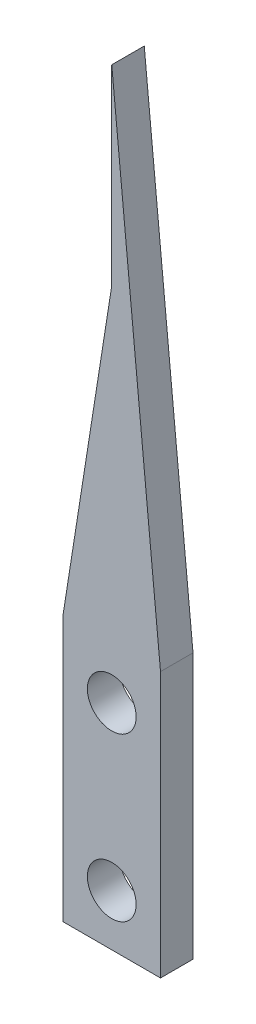
ISO-10303-21;
HEADER;
FILE_DESCRIPTION(('STEP AP214'),'2;1');
FILE_NAME('part.step','',(''),(''),'','','');
FILE_SCHEMA(('AUTOMOTIVE_DESIGN { 1 0 10303 214 1 1 1 1 }'));
ENDSEC;
DATA;
#1=APPLICATION_CONTEXT('core data for automotive mechanical design processes');
#2=APPLICATION_PROTOCOL_DEFINITION('international standard','automotive_design',2000,#1);
#3=PRODUCT_CONTEXT('',#1,'mechanical');
#4=PRODUCT('Part','Part','',(#3));
#5=PRODUCT_RELATED_PRODUCT_CATEGORY('part','',(#4));
#6=PRODUCT_DEFINITION_FORMATION('','',#4);
#7=PRODUCT_DEFINITION_CONTEXT('part definition',#1,'design');
#8=PRODUCT_DEFINITION('design','',#6,#7);
#9=PRODUCT_DEFINITION_SHAPE('','',#8);
#10=(LENGTH_UNIT() NAMED_UNIT(*) SI_UNIT(.MILLI.,.METRE.));
#11=(NAMED_UNIT(*) PLANE_ANGLE_UNIT() SI_UNIT($,.RADIAN.));
#12=(NAMED_UNIT(*) SI_UNIT($,.STERADIAN.) SOLID_ANGLE_UNIT());
#13=UNCERTAINTY_MEASURE_WITH_UNIT(LENGTH_MEASURE(1.E-05),#10,'distance_accuracy_value','');
#14=(GEOMETRIC_REPRESENTATION_CONTEXT(3) GLOBAL_UNCERTAINTY_ASSIGNED_CONTEXT((#13)) GLOBAL_UNIT_ASSIGNED_CONTEXT((#10,
#11,#12)) REPRESENTATION_CONTEXT('',''));
#15=CARTESIAN_POINT('',(0.,0.,0.));
#16=DIRECTION('',(0.,0.,1.));
#17=DIRECTION('',(1.,0.,0.));
#18=AXIS2_PLACEMENT_3D('',#15,#16,#17);
#19=CARTESIAN_POINT('',(0.,0.,2.));
#20=DIRECTION('',(0.,0.,1.));
#21=DIRECTION('',(1.,0.,0.));
#22=AXIS2_PLACEMENT_3D('',#19,#20,#21);
#23=PLANE('',#22);
#24=CARTESIAN_POINT('',(0.,0.,2.));
#25=DIRECTION('',(0.,0.,1.));
#26=DIRECTION('',(1.,0.,0.));
#27=AXIS2_PLACEMENT_3D('',#24,#25,#26);
#28=CIRCLE('',#27,1.5);
#29=CARTESIAN_POINT('',(1.5,0.,2.));
#30=VERTEX_POINT('',#29);
#31=EDGE_CURVE('E122',#30,#30,#28,.T.);
#32=ORIENTED_EDGE('',*,*,#31,.F.);
#33=EDGE_LOOP('',(#32));
#34=FACE_BOUND('',#33,.T.);
#35=DIRECTION('',(0.,-1.,0.));
#36=VECTOR('',#35,1.);
#37=CARTESIAN_POINT('',(0.,22.2285133566871,2.));
#38=LINE('',#37,#36);
#39=CARTESIAN_POINT('',(0.,34.,2.));
#40=VERTEX_POINT('',#39);
#41=CARTESIAN_POINT('',(0.,22.2285133566871,2.));
#42=VERTEX_POINT('',#41);
#43=EDGE_CURVE('E129',#40,#42,#38,.T.);
#44=ORIENTED_EDGE('',*,*,#43,.T.);
#45=DIRECTION('',(-0.15544898073964,-0.987843922078284,0.));
#46=VECTOR('',#45,1.);
#47=CARTESIAN_POINT('',(-3.,3.1641762852305,2.));
#48=LINE('',#47,#46);
#49=CARTESIAN_POINT('',(-3.,3.1641762852305,2.));
#50=VERTEX_POINT('',#49);
#51=EDGE_CURVE('E87',#42,#50,#48,.T.);
#52=ORIENTED_EDGE('',*,*,#51,.T.);
#53=DIRECTION('',(0.,-1.,0.));
#54=VECTOR('',#53,1.);
#55=CARTESIAN_POINT('',(-3.,3.1641762852305,2.));
#56=LINE('',#55,#54);
#57=CARTESIAN_POINT('',(-3.,-13.1641762852305,2.));
#58=VERTEX_POINT('',#57);
#59=EDGE_CURVE('E100',#50,#58,#56,.T.);
#60=ORIENTED_EDGE('',*,*,#59,.T.);
#61=DIRECTION('',(1.,0.,0.));
#62=VECTOR('',#61,1.);
#63=CARTESIAN_POINT('',(3.,-13.1641762852305,2.));
#64=LINE('',#63,#62);
#65=CARTESIAN_POINT('',(3.,-13.1641762852305,2.));
#66=VERTEX_POINT('',#65);
#67=EDGE_CURVE('E94',#58,#66,#64,.T.);
#68=ORIENTED_EDGE('',*,*,#67,.T.);
#69=DIRECTION('',(0.,1.,0.));
#70=VECTOR('',#69,1.);
#71=CARTESIAN_POINT('',(3.,3.16417628523051,2.));
#72=LINE('',#71,#70);
#73=CARTESIAN_POINT('',(3.,3.16417628523051,2.));
#74=VERTEX_POINT('',#73);
#75=EDGE_CURVE('E98',#66,#74,#72,.T.);
#76=ORIENTED_EDGE('',*,*,#75,.T.);
#77=DIRECTION('',(-0.0968322486260107,0.995300716178799,0.));
#78=VECTOR('',#77,1.);
#79=CARTESIAN_POINT('',(3.,3.16417628523051,2.));
#80=LINE('',#79,#78);
#81=EDGE_CURVE('E50',#74,#40,#80,.T.);
#82=ORIENTED_EDGE('',*,*,#81,.T.);
#83=EDGE_LOOP('',(#44,#52,#60,#68,#76,#82));
#84=FACE_BOUND('',#83,.T.);
#85=CARTESIAN_POINT('',(0.,-10.,2.));
#86=DIRECTION('',(0.,0.,1.));
#87=DIRECTION('',(1.,0.,0.));
#88=AXIS2_PLACEMENT_3D('',#85,#86,#87);
#89=CIRCLE('',#88,1.5);
#90=CARTESIAN_POINT('',(1.5,-10.,2.));
#91=VERTEX_POINT('',#90);
#92=EDGE_CURVE('E171',#91,#91,#89,.T.);
#93=ORIENTED_EDGE('',*,*,#92,.F.);
#94=EDGE_LOOP('',(#93));
#95=FACE_BOUND('',#94,.T.);
#96=ADVANCED_FACE('F33',(#34,#84,#95),#23,.T.);
#97=CARTESIAN_POINT('',(0.,0.,0.));
#98=DIRECTION('',(0.,0.,1.));
#99=DIRECTION('',(1.,0.,0.));
#100=AXIS2_PLACEMENT_3D('',#97,#98,#99);
#101=PLANE('',#100);
#102=DIRECTION('',(0.,-1.,0.));
#103=VECTOR('',#102,1.);
#104=CARTESIAN_POINT('',(0.,22.2285133566871,0.));
#105=LINE('',#104,#103);
#106=CARTESIAN_POINT('',(0.,34.,0.));
#107=VERTEX_POINT('',#106);
#108=CARTESIAN_POINT('',(0.,22.2285133566871,0.));
#109=VERTEX_POINT('',#108);
#110=EDGE_CURVE('E118',#107,#109,#105,.T.);
#111=ORIENTED_EDGE('',*,*,#110,.F.);
#112=DIRECTION('',(-0.0968322486260107,0.995300716178799,0.));
#113=VECTOR('',#112,1.);
#114=CARTESIAN_POINT('',(3.,3.16417628523051,0.));
#115=LINE('',#114,#113);
#116=CARTESIAN_POINT('',(3.,3.16417628523051,0.));
#117=VERTEX_POINT('',#116);
#118=EDGE_CURVE('E79',#117,#107,#115,.T.);
#119=ORIENTED_EDGE('',*,*,#118,.F.);
#120=DIRECTION('',(0.,1.,0.));
#121=VECTOR('',#120,1.);
#122=CARTESIAN_POINT('',(3.,3.16417628523051,0.));
#123=LINE('',#122,#121);
#124=CARTESIAN_POINT('',(3.,-13.1641762852305,0.));
#125=VERTEX_POINT('',#124);
#126=EDGE_CURVE('E73',#125,#117,#123,.T.);
#127=ORIENTED_EDGE('',*,*,#126,.F.);
#128=DIRECTION('',(1.,0.,0.));
#129=VECTOR('',#128,1.);
#130=CARTESIAN_POINT('',(3.,-13.1641762852305,0.));
#131=LINE('',#130,#129);
#132=CARTESIAN_POINT('',(-3.,-13.1641762852305,0.));
#133=VERTEX_POINT('',#132);
#134=EDGE_CURVE('E108',#133,#125,#131,.T.);
#135=ORIENTED_EDGE('',*,*,#134,.F.);
#136=DIRECTION('',(0.,-1.,0.));
#137=VECTOR('',#136,1.);
#138=CARTESIAN_POINT('',(-3.,3.1641762852305,0.));
#139=LINE('',#138,#137);
#140=CARTESIAN_POINT('',(-3.,3.1641762852305,0.));
#141=VERTEX_POINT('',#140);
#142=EDGE_CURVE('E124',#141,#133,#139,.T.);
#143=ORIENTED_EDGE('',*,*,#142,.F.);
#144=DIRECTION('',(-0.15544898073964,-0.987843922078284,0.));
#145=VECTOR('',#144,1.);
#146=CARTESIAN_POINT('',(-3.,3.1641762852305,0.));
#147=LINE('',#146,#145);
#148=EDGE_CURVE('E121',#109,#141,#147,.T.);
#149=ORIENTED_EDGE('',*,*,#148,.F.);
#150=EDGE_LOOP('',(#111,#119,#127,#135,#143,#149));
#151=FACE_BOUND('',#150,.T.);
#152=CARTESIAN_POINT('',(0.,0.,0.));
#153=DIRECTION('',(0.,0.,1.));
#154=DIRECTION('',(1.,0.,0.));
#155=AXIS2_PLACEMENT_3D('',#152,#153,#154);
#156=CIRCLE('',#155,1.5);
#157=CARTESIAN_POINT('',(1.5,0.,0.));
#158=VERTEX_POINT('',#157);
#159=EDGE_CURVE('E177',#158,#158,#156,.T.);
#160=ORIENTED_EDGE('',*,*,#159,.T.);
#161=EDGE_LOOP('',(#160));
#162=FACE_BOUND('',#161,.T.);
#163=CARTESIAN_POINT('',(0.,-10.,0.));
#164=DIRECTION('',(0.,0.,1.));
#165=DIRECTION('',(1.,0.,0.));
#166=AXIS2_PLACEMENT_3D('',#163,#164,#165);
#167=CIRCLE('',#166,1.5);
#168=CARTESIAN_POINT('',(1.5,-10.,0.));
#169=VERTEX_POINT('',#168);
#170=EDGE_CURVE('E174',#169,#169,#167,.T.);
#171=ORIENTED_EDGE('',*,*,#170,.T.);
#172=EDGE_LOOP('',(#171));
#173=FACE_BOUND('',#172,.T.);
#174=ADVANCED_FACE('F138',(#151,#162,#173),#101,.F.);
#175=CARTESIAN_POINT('',(0.,22.2285133566871,2.));
#176=DIRECTION('',(1.,0.,0.));
#177=DIRECTION('',(0.,1.,0.));
#178=AXIS2_PLACEMENT_3D('',#175,#176,#177);
#179=PLANE('',#178);
#180=ORIENTED_EDGE('',*,*,#110,.T.);
#181=DIRECTION('',(0.,0.,-1.));
#182=VECTOR('',#181,1.);
#183=CARTESIAN_POINT('',(0.,22.2285133566871,2.));
#184=LINE('',#183,#182);
#185=EDGE_CURVE('E11',#42,#109,#184,.T.);
#186=ORIENTED_EDGE('',*,*,#185,.F.);
#187=ORIENTED_EDGE('',*,*,#43,.F.);
#188=DIRECTION('',(0.,0.,-1.));
#189=VECTOR('',#188,1.);
#190=CARTESIAN_POINT('',(0.,34.,2.));
#191=LINE('',#190,#189);
#192=EDGE_CURVE('E114',#40,#107,#191,.T.);
#193=ORIENTED_EDGE('',*,*,#192,.T.);
#194=EDGE_LOOP('',(#180,#186,#187,#193));
#195=FACE_BOUND('',#194,.T.);
#196=ADVANCED_FACE('F35',(#195),#179,.F.);
#197=CARTESIAN_POINT('',(-3.,3.1641762852305,2.));
#198=DIRECTION('',(0.987843922078284,-0.15544898073964,0.));
#199=DIRECTION('',(0.15544898073964,0.987843922078284,0.));
#200=AXIS2_PLACEMENT_3D('',#197,#198,#199);
#201=PLANE('',#200);
#202=ORIENTED_EDGE('',*,*,#148,.T.);
#203=DIRECTION('',(0.,0.,-1.));
#204=VECTOR('',#203,1.);
#205=CARTESIAN_POINT('',(-3.,3.1641762852305,2.));
#206=LINE('',#205,#204);
#207=EDGE_CURVE('E42',#50,#141,#206,.T.);
#208=ORIENTED_EDGE('',*,*,#207,.F.);
#209=ORIENTED_EDGE('',*,*,#51,.F.);
#210=ORIENTED_EDGE('',*,*,#185,.T.);
#211=EDGE_LOOP('',(#202,#208,#209,#210));
#212=FACE_BOUND('',#211,.T.);
#213=ADVANCED_FACE('F218',(#212),#201,.F.);
#214=CARTESIAN_POINT('',(-3.,3.1641762852305,2.));
#215=DIRECTION('',(1.,0.,0.));
#216=DIRECTION('',(0.,1.,0.));
#217=AXIS2_PLACEMENT_3D('',#214,#215,#216);
#218=PLANE('',#217);
#219=ORIENTED_EDGE('',*,*,#142,.T.);
#220=DIRECTION('',(0.,0.,-1.));
#221=VECTOR('',#220,1.);
#222=CARTESIAN_POINT('',(-3.,-13.1641762852305,2.));
#223=LINE('',#222,#221);
#224=EDGE_CURVE('E109',#58,#133,#223,.T.);
#225=ORIENTED_EDGE('',*,*,#224,.F.);
#226=ORIENTED_EDGE('',*,*,#59,.F.);
#227=ORIENTED_EDGE('',*,*,#207,.T.);
#228=EDGE_LOOP('',(#219,#225,#226,#227));
#229=FACE_BOUND('',#228,.T.);
#230=ADVANCED_FACE('F135',(#229),#218,.F.);
#231=CARTESIAN_POINT('',(3.,-13.1641762852305,2.));
#232=DIRECTION('',(0.,1.,0.));
#233=DIRECTION('',(-1.,0.,0.));
#234=AXIS2_PLACEMENT_3D('',#231,#232,#233);
#235=PLANE('',#234);
#236=ORIENTED_EDGE('',*,*,#134,.T.);
#237=DIRECTION('',(0.,0.,-1.));
#238=VECTOR('',#237,1.);
#239=CARTESIAN_POINT('',(3.,-13.1641762852305,2.));
#240=LINE('',#239,#238);
#241=EDGE_CURVE('E105',#66,#125,#240,.T.);
#242=ORIENTED_EDGE('',*,*,#241,.F.);
#243=ORIENTED_EDGE('',*,*,#67,.F.);
#244=ORIENTED_EDGE('',*,*,#224,.T.);
#245=EDGE_LOOP('',(#236,#242,#243,#244));
#246=FACE_BOUND('',#245,.T.);
#247=ADVANCED_FACE('F106',(#246),#235,.F.);
#248=CARTESIAN_POINT('',(3.,3.16417628523051,2.));
#249=DIRECTION('',(-1.,0.,0.));
#250=DIRECTION('',(0.,-1.,0.));
#251=AXIS2_PLACEMENT_3D('',#248,#249,#250);
#252=PLANE('',#251);
#253=ORIENTED_EDGE('',*,*,#126,.T.);
#254=DIRECTION('',(0.,0.,-1.));
#255=VECTOR('',#254,1.);
#256=CARTESIAN_POINT('',(3.,3.16417628523051,2.));
#257=LINE('',#256,#255);
#258=EDGE_CURVE('E110',#74,#117,#257,.T.);
#259=ORIENTED_EDGE('',*,*,#258,.F.);
#260=ORIENTED_EDGE('',*,*,#75,.F.);
#261=ORIENTED_EDGE('',*,*,#241,.T.);
#262=EDGE_LOOP('',(#253,#259,#260,#261));
#263=FACE_BOUND('',#262,.T.);
#264=ADVANCED_FACE('F112',(#263),#252,.F.);
#265=CARTESIAN_POINT('',(3.,3.16417628523051,2.));
#266=DIRECTION('',(-0.995300716178799,-0.0968322486260107,0.));
#267=DIRECTION('',(0.0968322486260107,-0.995300716178799,0.));
#268=AXIS2_PLACEMENT_3D('',#265,#266,#267);
#269=PLANE('',#268);
#270=ORIENTED_EDGE('',*,*,#118,.T.);
#271=ORIENTED_EDGE('',*,*,#192,.F.);
#272=ORIENTED_EDGE('',*,*,#81,.F.);
#273=ORIENTED_EDGE('',*,*,#258,.T.);
#274=EDGE_LOOP('',(#270,#271,#272,#273));
#275=FACE_BOUND('',#274,.T.);
#276=ADVANCED_FACE('F143',(#275),#269,.F.);
#277=CARTESIAN_POINT('',(0.,0.,2.));
#278=DIRECTION('',(0.,0.,-1.));
#279=DIRECTION('',(-1.,0.,0.));
#280=AXIS2_PLACEMENT_3D('',#277,#278,#279);
#281=CYLINDRICAL_SURFACE('',#280,1.5);
#282=ORIENTED_EDGE('',*,*,#31,.T.);
#283=EDGE_LOOP('',(#282));
#284=FACE_BOUND('',#283,.T.);
#285=ORIENTED_EDGE('',*,*,#159,.F.);
#286=EDGE_LOOP('',(#285));
#287=FACE_BOUND('',#286,.T.);
#288=ADVANCED_FACE('F145',(#284,#287),#281,.F.);
#289=CARTESIAN_POINT('',(0.,-10.,2.));
#290=DIRECTION('',(0.,0.,-1.));
#291=DIRECTION('',(-1.,0.,0.));
#292=AXIS2_PLACEMENT_3D('',#289,#290,#291);
#293=CYLINDRICAL_SURFACE('',#292,1.5);
#294=ORIENTED_EDGE('',*,*,#92,.T.);
#295=EDGE_LOOP('',(#294));
#296=FACE_BOUND('',#295,.T.);
#297=ORIENTED_EDGE('',*,*,#170,.F.);
#298=EDGE_LOOP('',(#297));
#299=FACE_BOUND('',#298,.T.);
#300=ADVANCED_FACE('F151',(#296,#299),#293,.F.);
#301=CLOSED_SHELL('',(#96,#174,#196,#213,#230,#247,#264,#276,#288,#300));
#302=MANIFOLD_SOLID_BREP('B2',#301);
#303=ADVANCED_BREP_SHAPE_REPRESENTATION('',(#18,#302),#14);
#304=SHAPE_DEFINITION_REPRESENTATION(#9,#303);
ENDSEC;
END-ISO-10303-21;
